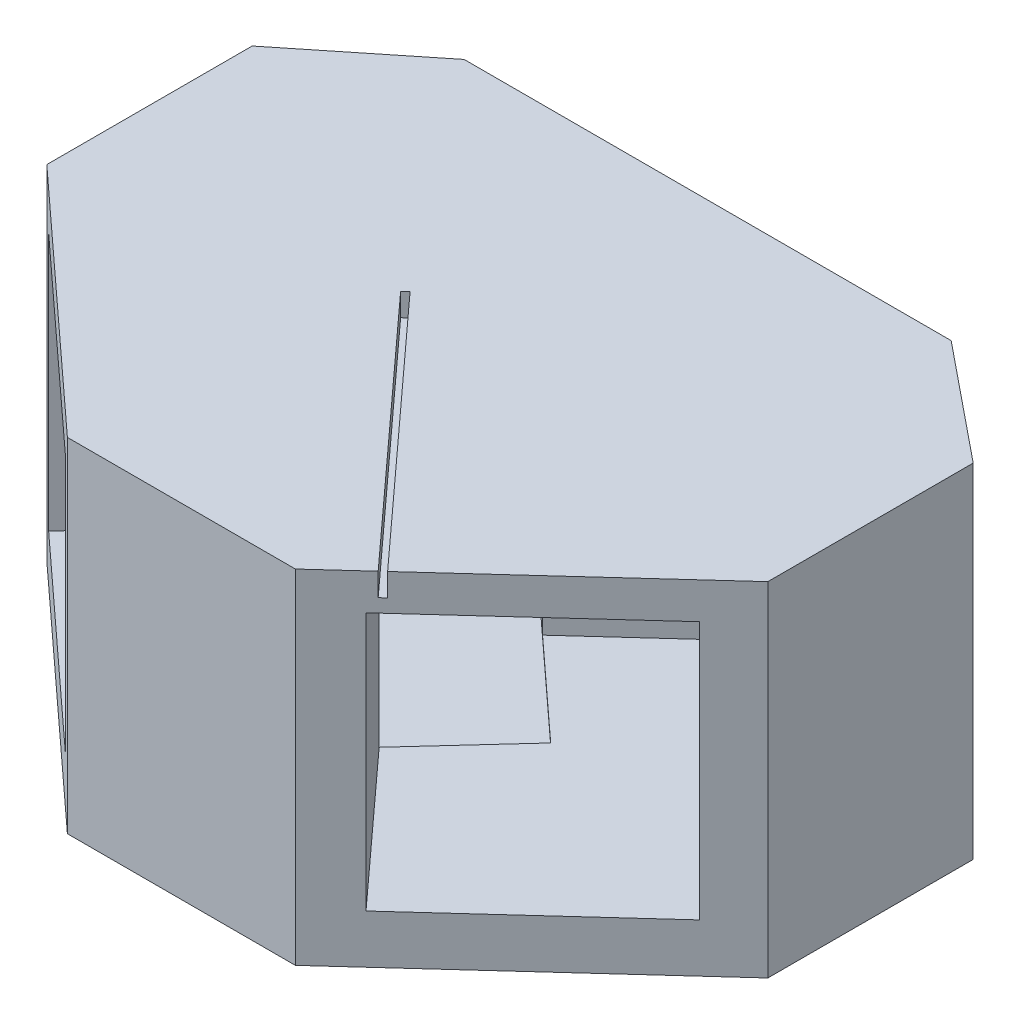
ISO-10303-21;
HEADER;
FILE_DESCRIPTION(('STEP AP214'),'2;1');
FILE_NAME('part.step','',(''),(''),'','','');
FILE_SCHEMA(('AUTOMOTIVE_DESIGN { 1 0 10303 214 1 1 1 1 }'));
ENDSEC;
DATA;
#1=APPLICATION_CONTEXT('core data for automotive mechanical design processes');
#2=APPLICATION_PROTOCOL_DEFINITION('international standard','automotive_design',2000,#1);
#3=PRODUCT_CONTEXT('',#1,'mechanical');
#4=PRODUCT('Part','Part','',(#3));
#5=PRODUCT_RELATED_PRODUCT_CATEGORY('part','',(#4));
#6=PRODUCT_DEFINITION_FORMATION('','',#4);
#7=PRODUCT_DEFINITION_CONTEXT('part definition',#1,'design');
#8=PRODUCT_DEFINITION('design','',#6,#7);
#9=PRODUCT_DEFINITION_SHAPE('','',#8);
#10=(LENGTH_UNIT() NAMED_UNIT(*) SI_UNIT(.MILLI.,.METRE.));
#11=(NAMED_UNIT(*) PLANE_ANGLE_UNIT() SI_UNIT($,.RADIAN.));
#12=(NAMED_UNIT(*) SI_UNIT($,.STERADIAN.) SOLID_ANGLE_UNIT());
#13=UNCERTAINTY_MEASURE_WITH_UNIT(LENGTH_MEASURE(1.E-05),#10,'distance_accuracy_value','');
#14=(GEOMETRIC_REPRESENTATION_CONTEXT(3) GLOBAL_UNCERTAINTY_ASSIGNED_CONTEXT((#13)) GLOBAL_UNIT_ASSIGNED_CONTEXT((#10,
#11,#12)) REPRESENTATION_CONTEXT('',''));
#15=CARTESIAN_POINT('',(0.,0.,0.));
#16=DIRECTION('',(0.,0.,1.));
#17=DIRECTION('',(1.,0.,0.));
#18=AXIS2_PLACEMENT_3D('',#15,#16,#17);
#19=CARTESIAN_POINT('',(-826.128986822205,117.,44.3964777462841));
#20=DIRECTION('',(1.,0.,0.));
#21=DIRECTION('',(0.,0.,-1.));
#22=AXIS2_PLACEMENT_3D('',#19,#20,#21);
#23=PLANE('',#22);
#24=DIRECTION('',(0.,0.,1.));
#25=VECTOR('',#24,1.);
#26=CARTESIAN_POINT('',(-826.128986822205,0.,44.3964777462841));
#27=LINE('',#26,#25);
#28=CARTESIAN_POINT('',(-826.128986822205,0.,44.3964777462841));
#29=VERTEX_POINT('',#28);
#30=CARTESIAN_POINT('',(-826.128986822205,0.,114.396477746284));
#31=VERTEX_POINT('',#30);
#32=EDGE_CURVE('E273',#29,#31,#27,.T.);
#33=ORIENTED_EDGE('',*,*,#32,.T.);
#34=DIRECTION('',(0.,-1.,0.));
#35=VECTOR('',#34,1.);
#36=CARTESIAN_POINT('',(-826.128986822205,117.,114.396477746284));
#37=LINE('',#36,#35);
#38=CARTESIAN_POINT('',(-826.128986822205,117.,114.396477746284));
#39=VERTEX_POINT('',#38);
#40=EDGE_CURVE('E397',#39,#31,#37,.T.);
#41=ORIENTED_EDGE('',*,*,#40,.F.);
#42=DIRECTION('',(0.,0.,1.));
#43=VECTOR('',#42,1.);
#44=CARTESIAN_POINT('',(-826.128986822205,117.,44.3964777462841));
#45=LINE('',#44,#43);
#46=CARTESIAN_POINT('',(-826.128986822205,117.,44.3964777462841));
#47=VERTEX_POINT('',#46);
#48=EDGE_CURVE('E318',#47,#39,#45,.T.);
#49=ORIENTED_EDGE('',*,*,#48,.F.);
#50=DIRECTION('',(0.,-1.,0.));
#51=VECTOR('',#50,1.);
#52=CARTESIAN_POINT('',(-826.128986822205,117.,44.3964777462841));
#53=LINE('',#52,#51);
#54=EDGE_CURVE('E346',#47,#29,#53,.T.);
#55=ORIENTED_EDGE('',*,*,#54,.T.);
#56=EDGE_LOOP('',(#33,#41,#49,#55));
#57=FACE_BOUND('',#56,.T.);
#58=ADVANCED_FACE('F39',(#57),#23,.F.);
#59=CARTESIAN_POINT('',(-742.08602868947,117.,191.421027003644));
#60=DIRECTION('',(0.675653940854031,0.,-0.7372189309889));
#61=DIRECTION('',(-0.7372189309889,0.,-0.675653940854031));
#62=AXIS2_PLACEMENT_3D('',#59,#60,#61);
#63=PLANE('',#62);
#64=DIRECTION('',(0.7372189309889,0.,0.675653940854031));
#65=VECTOR('',#64,1.);
#66=CARTESIAN_POINT('',(-818.637453873942,15.9702081014861,121.262394432311));
#67=LINE('',#66,#65);
#68=CARTESIAN_POINT('',(-818.637453873942,15.9702081014861,121.262394432311));
#69=VERTEX_POINT('',#68);
#70=CARTESIAN_POINT('',(-748.962414499242,15.9702081014861,185.11888665441));
#71=VERTEX_POINT('',#70);
#72=EDGE_CURVE('E223',#69,#71,#67,.T.);
#73=ORIENTED_EDGE('',*,*,#72,.F.);
#74=DIRECTION('',(0.,-1.,0.));
#75=VECTOR('',#74,1.);
#76=CARTESIAN_POINT('',(-818.637453873942,103.962880994965,121.262394432311));
#77=LINE('',#76,#75);
#78=CARTESIAN_POINT('',(-818.637453873942,103.962880994965,121.262394432311));
#79=VERTEX_POINT('',#78);
#80=EDGE_CURVE('E54',#79,#69,#77,.T.);
#81=ORIENTED_EDGE('',*,*,#80,.F.);
#82=DIRECTION('',(-0.7372189309889,0.,-0.675653940854031));
#83=VECTOR('',#82,1.);
#84=CARTESIAN_POINT('',(-818.637453873942,103.962880994965,121.262394432311));
#85=LINE('',#84,#83);
#86=CARTESIAN_POINT('',(-748.962414499242,103.962880994965,185.11888665441));
#87=VERTEX_POINT('',#86);
#88=EDGE_CURVE('E210',#87,#79,#85,.T.);
#89=ORIENTED_EDGE('',*,*,#88,.F.);
#90=DIRECTION('',(0.,1.,0.));
#91=VECTOR('',#90,1.);
#92=CARTESIAN_POINT('',(-748.962414499242,103.962880994965,185.11888665441));
#93=LINE('',#92,#91);
#94=EDGE_CURVE('E214',#71,#87,#93,.T.);
#95=ORIENTED_EDGE('',*,*,#94,.F.);
#96=EDGE_LOOP('',(#73,#81,#89,#95));
#97=FACE_BOUND('',#96,.T.);
#98=DIRECTION('',(0.7372189309889,0.,0.675653940854031));
#99=VECTOR('',#98,1.);
#100=CARTESIAN_POINT('',(-742.08602868947,0.,191.421027003644));
#101=LINE('',#100,#99);
#102=CARTESIAN_POINT('',(-742.08602868947,0.,191.421027003644));
#103=VERTEX_POINT('',#102);
#104=EDGE_CURVE('E350',#31,#103,#101,.T.);
#105=ORIENTED_EDGE('',*,*,#104,.T.);
#106=DIRECTION('',(0.,-1.,0.));
#107=VECTOR('',#106,1.);
#108=CARTESIAN_POINT('',(-742.08602868947,117.,191.421027003644));
#109=LINE('',#108,#107);
#110=CARTESIAN_POINT('',(-742.08602868947,117.,191.421027003644));
#111=VERTEX_POINT('',#110);
#112=EDGE_CURVE('E393',#111,#103,#109,.T.);
#113=ORIENTED_EDGE('',*,*,#112,.F.);
#114=DIRECTION('',(0.7372189309889,0.,0.675653940854031));
#115=VECTOR('',#114,1.);
#116=CARTESIAN_POINT('',(-742.08602868947,117.,191.421027003644));
#117=LINE('',#116,#115);
#118=EDGE_CURVE('E322',#39,#111,#117,.T.);
#119=ORIENTED_EDGE('',*,*,#118,.F.);
#120=ORIENTED_EDGE('',*,*,#40,.T.);
#121=EDGE_LOOP('',(#105,#113,#119,#120));
#122=FACE_BOUND('',#121,.T.);
#123=ADVANCED_FACE('F446',(#97,#122),#63,.F.);
#124=CARTESIAN_POINT('',(-664.384727067971,117.,191.421027003644));
#125=DIRECTION('',(0.,0.,-1.));
#126=DIRECTION('',(-1.,0.,0.));
#127=AXIS2_PLACEMENT_3D('',#124,#125,#126);
#128=PLANE('',#127);
#129=DIRECTION('',(1.,0.,0.));
#130=VECTOR('',#129,1.);
#131=CARTESIAN_POINT('',(-664.384727067971,0.,191.421027003644));
#132=LINE('',#131,#130);
#133=CARTESIAN_POINT('',(-664.384727067971,0.,191.421027003644));
#134=VERTEX_POINT('',#133);
#135=EDGE_CURVE('E353',#103,#134,#132,.T.);
#136=ORIENTED_EDGE('',*,*,#135,.T.);
#137=DIRECTION('',(0.,-1.,0.));
#138=VECTOR('',#137,1.);
#139=CARTESIAN_POINT('',(-664.384727067971,117.,191.421027003644));
#140=LINE('',#139,#138);
#141=CARTESIAN_POINT('',(-664.384727067971,117.,191.421027003644));
#142=VERTEX_POINT('',#141);
#143=EDGE_CURVE('E389',#142,#134,#140,.T.);
#144=ORIENTED_EDGE('',*,*,#143,.F.);
#145=DIRECTION('',(1.,0.,0.));
#146=VECTOR('',#145,1.);
#147=CARTESIAN_POINT('',(-664.384727067971,117.,191.421027003644));
#148=LINE('',#147,#146);
#149=EDGE_CURVE('E326',#111,#142,#148,.T.);
#150=ORIENTED_EDGE('',*,*,#149,.F.);
#151=ORIENTED_EDGE('',*,*,#112,.T.);
#152=EDGE_LOOP('',(#136,#144,#150,#151));
#153=FACE_BOUND('',#152,.T.);
#154=ADVANCED_FACE('F449',(#153),#128,.F.);
#155=CARTESIAN_POINT('',(-580.129096877642,117.,114.629173391229));
#156=DIRECTION('',(-0.673612750986098,0.,-0.739084475353759));
#157=DIRECTION('',(-0.739084475353759,0.,0.673612750986098));
#158=AXIS2_PLACEMENT_3D('',#155,#156,#157);
#159=PLANE('',#158);
#160=DIRECTION('',(0.73908447535376,0.,-0.673612750986097));
#161=VECTOR('',#160,1.);
#162=CARTESIAN_POINT('',(-651.786182515414,16.6091042605447,179.938523260879));
#163=LINE('',#162,#161);
#164=CARTESIAN_POINT('',(-651.786182515414,16.6091042605447,179.938523260879));
#165=VERTEX_POINT('',#164);
#166=CARTESIAN_POINT('',(-592.273770508985,16.6091042605447,125.698012322964));
#167=VERTEX_POINT('',#166);
#168=EDGE_CURVE('E297',#165,#167,#163,.T.);
#169=ORIENTED_EDGE('',*,*,#168,.F.);
#170=DIRECTION('',(0.,-1.,0.));
#171=VECTOR('',#170,1.);
#172=CARTESIAN_POINT('',(-651.786182515414,104.628885191697,179.938523260879));
#173=LINE('',#172,#171);
#174=CARTESIAN_POINT('',(-651.786182515414,104.628885191697,179.938523260879));
#175=VERTEX_POINT('',#174);
#176=EDGE_CURVE('E247',#175,#165,#173,.T.);
#177=ORIENTED_EDGE('',*,*,#176,.F.);
#178=DIRECTION('',(-0.73908447535376,0.,0.673612750986097));
#179=VECTOR('',#178,1.);
#180=CARTESIAN_POINT('',(-651.786182515414,104.628885191697,179.938523260879));
#181=LINE('',#180,#179);
#182=CARTESIAN_POINT('',(-592.273770508985,104.628885191697,125.698012322964));
#183=VERTEX_POINT('',#182);
#184=EDGE_CURVE('E282',#183,#175,#181,.T.);
#185=ORIENTED_EDGE('',*,*,#184,.F.);
#186=DIRECTION('',(0.,1.,0.));
#187=VECTOR('',#186,1.);
#188=CARTESIAN_POINT('',(-592.273770508985,104.628885191697,125.698012322964));
#189=LINE('',#188,#187);
#190=EDGE_CURVE('E301',#167,#183,#189,.T.);
#191=ORIENTED_EDGE('',*,*,#190,.F.);
#192=EDGE_LOOP('',(#169,#177,#185,#191));
#193=FACE_BOUND('',#192,.T.);
#194=DIRECTION('',(0.739084475353759,0.,-0.673612750986098));
#195=VECTOR('',#194,1.);
#196=CARTESIAN_POINT('',(-580.129096877642,117.,114.629173391229));
#197=LINE('',#196,#195);
#198=CARTESIAN_POINT('',(-647.931127486634,117.,176.424967896458));
#199=VERTEX_POINT('',#198);
#200=CARTESIAN_POINT('',(-580.129096877642,117.,114.629173391229));
#201=VERTEX_POINT('',#200);
#202=EDGE_CURVE('E329',#199,#201,#197,.T.);
#203=ORIENTED_EDGE('',*,*,#202,.F.);
#204=DIRECTION('',(0.,1.,0.));
#205=VECTOR('',#204,1.);
#206=CARTESIAN_POINT('',(-647.931127486634,132.990814602846,176.424967896458));
#207=LINE('',#206,#205);
#208=CARTESIAN_POINT('',(-647.931127486634,109.192873832572,176.424967896458));
#209=VERTEX_POINT('',#208);
#210=EDGE_CURVE('E260',#209,#199,#207,.T.);
#211=ORIENTED_EDGE('',*,*,#210,.F.);
#212=DIRECTION('',(0.739084475353746,0.,-0.673612750986112));
#213=VECTOR('',#212,1.);
#214=CARTESIAN_POINT('',(-647.931127486634,109.192873832572,176.424967896458));
#215=LINE('',#214,#213);
#216=CARTESIAN_POINT('',(-649.617714061739,109.192873832572,177.962148368404));
#217=VERTEX_POINT('',#216);
#218=EDGE_CURVE('E252',#217,#209,#215,.T.);
#219=ORIENTED_EDGE('',*,*,#218,.F.);
#220=DIRECTION('',(0.,-1.,0.));
#221=VECTOR('',#220,1.);
#222=CARTESIAN_POINT('',(-649.617714061739,132.990814602846,177.962148368404));
#223=LINE('',#222,#221);
#224=CARTESIAN_POINT('',(-649.617714061739,117.,177.962148368404));
#225=VERTEX_POINT('',#224);
#226=EDGE_CURVE('E263',#225,#217,#223,.T.);
#227=ORIENTED_EDGE('',*,*,#226,.F.);
#228=EDGE_CURVE('E330',#142,#225,#197,.T.);
#229=ORIENTED_EDGE('',*,*,#228,.F.);
#230=ORIENTED_EDGE('',*,*,#143,.T.);
#231=DIRECTION('',(0.739084475353759,0.,-0.673612750986098));
#232=VECTOR('',#231,1.);
#233=CARTESIAN_POINT('',(-580.129096877642,0.,114.629173391229));
#234=LINE('',#233,#232);
#235=CARTESIAN_POINT('',(-580.129096877642,0.,114.629173391229));
#236=VERTEX_POINT('',#235);
#237=EDGE_CURVE('E356',#134,#236,#234,.T.);
#238=ORIENTED_EDGE('',*,*,#237,.T.);
#239=DIRECTION('',(0.,-1.,0.));
#240=VECTOR('',#239,1.);
#241=CARTESIAN_POINT('',(-580.129096877642,117.,114.629173391229));
#242=LINE('',#241,#240);
#243=EDGE_CURVE('E385',#201,#236,#242,.T.);
#244=ORIENTED_EDGE('',*,*,#243,.F.);
#245=EDGE_LOOP('',(#203,#211,#219,#227,#229,#230,#238,#244));
#246=FACE_BOUND('',#245,.T.);
#247=ADVANCED_FACE('F435',(#193,#246),#159,.F.);
#248=CARTESIAN_POINT('',(-580.129096877642,117.,44.6291733912285));
#249=DIRECTION('',(-1.,0.,0.));
#250=DIRECTION('',(0.,0.,1.));
#251=AXIS2_PLACEMENT_3D('',#248,#249,#250);
#252=PLANE('',#251);
#253=DIRECTION('',(0.,0.,-1.));
#254=VECTOR('',#253,1.);
#255=CARTESIAN_POINT('',(-580.129096877642,0.,44.6291733912285));
#256=LINE('',#255,#254);
#257=CARTESIAN_POINT('',(-580.129096877642,0.,44.6291733912285));
#258=VERTEX_POINT('',#257);
#259=EDGE_CURVE('E359',#236,#258,#256,.T.);
#260=ORIENTED_EDGE('',*,*,#259,.T.);
#261=DIRECTION('',(0.,-1.,0.));
#262=VECTOR('',#261,1.);
#263=CARTESIAN_POINT('',(-580.129096877642,117.,44.6291733912285));
#264=LINE('',#263,#262);
#265=CARTESIAN_POINT('',(-580.129096877642,117.,44.6291733912285));
#266=VERTEX_POINT('',#265);
#267=EDGE_CURVE('E381',#266,#258,#264,.T.);
#268=ORIENTED_EDGE('',*,*,#267,.F.);
#269=DIRECTION('',(0.,0.,-1.));
#270=VECTOR('',#269,1.);
#271=CARTESIAN_POINT('',(-580.129096877642,117.,44.6291733912285));
#272=LINE('',#271,#270);
#273=EDGE_CURVE('E334',#201,#266,#272,.T.);
#274=ORIENTED_EDGE('',*,*,#273,.F.);
#275=ORIENTED_EDGE('',*,*,#243,.T.);
#276=EDGE_LOOP('',(#260,#268,#274,#275));
#277=FACE_BOUND('',#276,.T.);
#278=ADVANCED_FACE('F467',(#277),#252,.F.);
#279=CARTESIAN_POINT('',(-620.035151566859,117.,12.2336984118236));
#280=DIRECTION('',(-0.630262159132391,0.,0.776382386949741));
#281=DIRECTION('',(0.776382386949741,0.,0.630262159132391));
#282=AXIS2_PLACEMENT_3D('',#279,#280,#281);
#283=PLANE('',#282);
#284=DIRECTION('',(-0.776382386949741,0.,-0.630262159132391));
#285=VECTOR('',#284,1.);
#286=CARTESIAN_POINT('',(-620.035151566859,0.,12.2336984118236));
#287=LINE('',#286,#285);
#288=CARTESIAN_POINT('',(-620.035151566859,0.,12.2336984118236));
#289=VERTEX_POINT('',#288);
#290=EDGE_CURVE('E362',#258,#289,#287,.T.);
#291=ORIENTED_EDGE('',*,*,#290,.T.);
#292=DIRECTION('',(0.,-1.,0.));
#293=VECTOR('',#292,1.);
#294=CARTESIAN_POINT('',(-620.035151566859,117.,12.2336984118236));
#295=LINE('',#294,#293);
#296=CARTESIAN_POINT('',(-620.035151566859,117.,12.2336984118236));
#297=VERTEX_POINT('',#296);
#298=EDGE_CURVE('E377',#297,#289,#295,.T.);
#299=ORIENTED_EDGE('',*,*,#298,.F.);
#300=DIRECTION('',(-0.776382386949741,0.,-0.630262159132391));
#301=VECTOR('',#300,1.);
#302=CARTESIAN_POINT('',(-620.035151566859,117.,12.2336984118236));
#303=LINE('',#302,#301);
#304=EDGE_CURVE('E337',#266,#297,#303,.T.);
#305=ORIENTED_EDGE('',*,*,#304,.F.);
#306=ORIENTED_EDGE('',*,*,#267,.T.);
#307=EDGE_LOOP('',(#291,#299,#305,#306));
#308=FACE_BOUND('',#307,.T.);
#309=ADVANCED_FACE('F501',(#308),#283,.F.);
#310=CARTESIAN_POINT('',(-786.035151566859,117.,12.2336984118236));
#311=DIRECTION('',(0.,0.,1.));
#312=DIRECTION('',(1.,0.,0.));
#313=AXIS2_PLACEMENT_3D('',#310,#311,#312);
#314=PLANE('',#313);
#315=DIRECTION('',(-1.,0.,0.));
#316=VECTOR('',#315,1.);
#317=CARTESIAN_POINT('',(-786.035151566859,0.,12.2336984118236));
#318=LINE('',#317,#316);
#319=CARTESIAN_POINT('',(-786.035151566859,0.,12.2336984118236));
#320=VERTEX_POINT('',#319);
#321=EDGE_CURVE('E365',#289,#320,#318,.T.);
#322=ORIENTED_EDGE('',*,*,#321,.T.);
#323=DIRECTION('',(0.,-1.,0.));
#324=VECTOR('',#323,1.);
#325=CARTESIAN_POINT('',(-786.035151566859,117.,12.2336984118236));
#326=LINE('',#325,#324);
#327=CARTESIAN_POINT('',(-786.035151566859,117.,12.2336984118236));
#328=VERTEX_POINT('',#327);
#329=EDGE_CURVE('E373',#328,#320,#326,.T.);
#330=ORIENTED_EDGE('',*,*,#329,.F.);
#331=DIRECTION('',(-1.,0.,0.));
#332=VECTOR('',#331,1.);
#333=CARTESIAN_POINT('',(-786.035151566859,117.,12.2336984118236));
#334=LINE('',#333,#332);
#335=EDGE_CURVE('E340',#297,#328,#334,.T.);
#336=ORIENTED_EDGE('',*,*,#335,.F.);
#337=ORIENTED_EDGE('',*,*,#298,.T.);
#338=EDGE_LOOP('',(#322,#330,#336,#337));
#339=FACE_BOUND('',#338,.T.);
#340=ADVANCED_FACE('F499',(#339),#314,.F.);
#341=CARTESIAN_POINT('',(-826.128986822205,117.,44.3964777462841));
#342=DIRECTION('',(0.625735006507013,0.,0.78003570535692));
#343=DIRECTION('',(0.780035705356921,0.,-0.625735006507013));
#344=AXIS2_PLACEMENT_3D('',#341,#342,#343);
#345=PLANE('',#344);
#346=DIRECTION('',(-0.780035705356921,0.,0.625735006507013));
#347=VECTOR('',#346,1.);
#348=CARTESIAN_POINT('',(-826.128986822205,0.,44.3964777462841));
#349=LINE('',#348,#347);
#350=EDGE_CURVE('E323',#320,#29,#349,.T.);
#351=ORIENTED_EDGE('',*,*,#350,.T.);
#352=ORIENTED_EDGE('',*,*,#54,.F.);
#353=DIRECTION('',(-0.780035705356921,0.,0.625735006507013));
#354=VECTOR('',#353,1.);
#355=CARTESIAN_POINT('',(-826.128986822205,117.,44.3964777462841));
#356=LINE('',#355,#354);
#357=EDGE_CURVE('E343',#328,#47,#356,.T.);
#358=ORIENTED_EDGE('',*,*,#357,.F.);
#359=ORIENTED_EDGE('',*,*,#329,.T.);
#360=EDGE_LOOP('',(#351,#352,#358,#359));
#361=FACE_BOUND('',#360,.T.);
#362=ADVANCED_FACE('F495',(#361),#345,.F.);
#363=CARTESIAN_POINT('',(0.,117.,0.));
#364=DIRECTION('',(0.,-1.,0.));
#365=DIRECTION('',(0.,0.,-1.));
#366=AXIS2_PLACEMENT_3D('',#363,#364,#365);
#367=PLANE('',#366);
#368=DIRECTION('',(0.739084475353746,0.,-0.673612750986112));
#369=VECTOR('',#368,1.);
#370=CARTESIAN_POINT('',(-284.979765273042,117.,-312.678345228656));
#371=LINE('',#370,#369);
#372=CARTESIAN_POINT('',(-728.430405927112,117.,91.4892647520145));
#373=VERTEX_POINT('',#372);
#374=CARTESIAN_POINT('',(-726.743819352008,117.,89.9520842800683));
#375=VERTEX_POINT('',#374);
#376=EDGE_CURVE('E401',#373,#375,#371,.T.);
#377=ORIENTED_EDGE('',*,*,#376,.T.);
#378=DIRECTION('',(0.673612750986098,0.,0.739084475353759));
#379=VECTOR('',#378,1.);
#380=CARTESIAN_POINT('',(-441.764054078979,117.,402.630429508722));
#381=LINE('',#380,#379);
#382=EDGE_CURVE('E409',#375,#199,#381,.T.);
#383=ORIENTED_EDGE('',*,*,#382,.T.);
#384=ORIENTED_EDGE('',*,*,#202,.T.);
#385=ORIENTED_EDGE('',*,*,#273,.T.);
#386=ORIENTED_EDGE('',*,*,#304,.T.);
#387=ORIENTED_EDGE('',*,*,#335,.T.);
#388=ORIENTED_EDGE('',*,*,#357,.T.);
#389=ORIENTED_EDGE('',*,*,#48,.T.);
#390=ORIENTED_EDGE('',*,*,#118,.T.);
#391=ORIENTED_EDGE('',*,*,#149,.T.);
#392=ORIENTED_EDGE('',*,*,#228,.T.);
#393=DIRECTION('',(-0.673612750986098,0.,-0.739084475353759));
#394=VECTOR('',#393,1.);
#395=CARTESIAN_POINT('',(-443.450640654083,117.,404.167609980668));
#396=LINE('',#395,#394);
#397=EDGE_CURVE('E405',#225,#373,#396,.T.);
#398=ORIENTED_EDGE('',*,*,#397,.T.);
#399=EDGE_LOOP('',(#377,#383,#384,#385,#386,#387,#388,#389,#390,#391,#392,#398));
#400=FACE_BOUND('',#399,.T.);
#401=ADVANCED_FACE('F471',(#400),#367,.F.);
#402=CARTESIAN_POINT('',(0.,0.,0.));
#403=DIRECTION('',(0.,-1.,0.));
#404=DIRECTION('',(0.,0.,-1.));
#405=AXIS2_PLACEMENT_3D('',#402,#403,#404);
#406=PLANE('',#405);
#407=ORIENTED_EDGE('',*,*,#32,.F.);
#408=ORIENTED_EDGE('',*,*,#350,.F.);
#409=ORIENTED_EDGE('',*,*,#321,.F.);
#410=ORIENTED_EDGE('',*,*,#290,.F.);
#411=ORIENTED_EDGE('',*,*,#259,.F.);
#412=ORIENTED_EDGE('',*,*,#237,.F.);
#413=ORIENTED_EDGE('',*,*,#135,.F.);
#414=ORIENTED_EDGE('',*,*,#104,.F.);
#415=EDGE_LOOP('',(#407,#408,#409,#410,#411,#412,#413,#414));
#416=FACE_BOUND('',#415,.T.);
#417=ADVANCED_FACE('F459',(#416),#406,.T.);
#418=CARTESIAN_POINT('',(-726.743819352008,132.990814602846,89.9520842800684));
#419=DIRECTION('',(0.739084475353759,0.,-0.673612750986098));
#420=DIRECTION('',(-0.673612750986098,0.,-0.739084475353759));
#421=AXIS2_PLACEMENT_3D('',#418,#419,#420);
#422=PLANE('',#421);
#423=DIRECTION('',(0.,1.,0.));
#424=VECTOR('',#423,1.);
#425=CARTESIAN_POINT('',(-726.743819352008,132.990814602846,89.9520842800684));
#426=LINE('',#425,#424);
#427=CARTESIAN_POINT('',(-726.743819352008,109.192873832572,89.9520842800684));
#428=VERTEX_POINT('',#427);
#429=EDGE_CURVE('E248',#428,#375,#426,.T.);
#430=ORIENTED_EDGE('',*,*,#429,.F.);
#431=DIRECTION('',(0.673612750986098,0.,0.739084475353759));
#432=VECTOR('',#431,1.);
#433=CARTESIAN_POINT('',(-726.743819352008,109.192873832572,89.9520842800684));
#434=LINE('',#433,#432);
#435=EDGE_CURVE('E270',#428,#209,#434,.T.);
#436=ORIENTED_EDGE('',*,*,#435,.T.);
#437=ORIENTED_EDGE('',*,*,#210,.T.);
#438=ORIENTED_EDGE('',*,*,#382,.F.);
#439=EDGE_LOOP('',(#430,#436,#437,#438));
#440=FACE_BOUND('',#439,.T.);
#441=ADVANCED_FACE('F480',(#440),#422,.F.);
#442=CARTESIAN_POINT('',(-728.430405927112,132.990814602846,91.4892647520145));
#443=DIRECTION('',(-0.739084475353759,0.,0.673612750986098));
#444=DIRECTION('',(0.673612750986098,0.,0.739084475353759));
#445=AXIS2_PLACEMENT_3D('',#442,#443,#444);
#446=PLANE('',#445);
#447=ORIENTED_EDGE('',*,*,#226,.T.);
#448=DIRECTION('',(0.673612750986098,0.,0.739084475353759));
#449=VECTOR('',#448,1.);
#450=CARTESIAN_POINT('',(-728.430405927112,109.192873832572,91.4892647520145));
#451=LINE('',#450,#449);
#452=CARTESIAN_POINT('',(-728.430405927112,109.192873832572,91.4892647520145));
#453=VERTEX_POINT('',#452);
#454=EDGE_CURVE('E259',#453,#217,#451,.T.);
#455=ORIENTED_EDGE('',*,*,#454,.F.);
#456=DIRECTION('',(0.,-1.,0.));
#457=VECTOR('',#456,1.);
#458=CARTESIAN_POINT('',(-728.430405927112,132.990814602846,91.4892647520145));
#459=LINE('',#458,#457);
#460=EDGE_CURVE('E251',#373,#453,#459,.T.);
#461=ORIENTED_EDGE('',*,*,#460,.F.);
#462=ORIENTED_EDGE('',*,*,#397,.F.);
#463=EDGE_LOOP('',(#447,#455,#461,#462));
#464=FACE_BOUND('',#463,.T.);
#465=ADVANCED_FACE('F487',(#464),#446,.F.);
#466=CARTESIAN_POINT('',(-284.979765273041,0.,-312.678345228658));
#467=DIRECTION('',(-0.673612750986112,0.,-0.739084475353746));
#468=DIRECTION('',(-0.739084475353746,0.,0.673612750986112));
#469=AXIS2_PLACEMENT_3D('',#466,#467,#468);
#470=PLANE('',#469);
#471=ORIENTED_EDGE('',*,*,#460,.T.);
#472=DIRECTION('',(0.739084475353746,0.,-0.673612750986112));
#473=VECTOR('',#472,1.);
#474=CARTESIAN_POINT('',(-726.743819352008,109.192873832572,89.9520842800684));
#475=LINE('',#474,#473);
#476=EDGE_CURVE('E255',#453,#428,#475,.T.);
#477=ORIENTED_EDGE('',*,*,#476,.T.);
#478=ORIENTED_EDGE('',*,*,#429,.T.);
#479=ORIENTED_EDGE('',*,*,#376,.F.);
#480=EDGE_LOOP('',(#471,#477,#478,#479));
#481=FACE_BOUND('',#480,.T.);
#482=ADVANCED_FACE('F579',(#481),#470,.F.);
#483=CARTESIAN_POINT('',(-726.743819352008,109.192873832572,89.9520842800684));
#484=DIRECTION('',(0.,-1.,0.));
#485=DIRECTION('',(0.,0.,-1.));
#486=AXIS2_PLACEMENT_3D('',#483,#484,#485);
#487=PLANE('',#486);
#488=ORIENTED_EDGE('',*,*,#218,.T.);
#489=ORIENTED_EDGE('',*,*,#435,.F.);
#490=ORIENTED_EDGE('',*,*,#476,.F.);
#491=ORIENTED_EDGE('',*,*,#454,.T.);
#492=EDGE_LOOP('',(#488,#489,#490,#491));
#493=FACE_BOUND('',#492,.T.);
#494=ADVANCED_FACE('F483',(#493),#487,.F.);
#495=CARTESIAN_POINT('',(-730.598874380788,104.628885191697,93.4656396444893));
#496=DIRECTION('',(-0.739084475353759,0.,0.673612750986098));
#497=DIRECTION('',(0.673612750986098,0.,0.739084475353759));
#498=AXIS2_PLACEMENT_3D('',#495,#496,#497);
#499=PLANE('',#498);
#500=DIRECTION('',(0.,1.,0.));
#501=VECTOR('',#500,1.);
#502=CARTESIAN_POINT('',(-697.872109948462,104.628885191697,129.373278692419));
#503=LINE('',#502,#501);
#504=CARTESIAN_POINT('',(-697.872109948462,16.6091042605447,129.373278692419));
#505=VERTEX_POINT('',#504);
#506=CARTESIAN_POINT('',(-697.872109948462,103.962880994965,129.373278692419));
#507=VERTEX_POINT('',#506);
#508=EDGE_CURVE('E243',#505,#507,#503,.T.);
#509=ORIENTED_EDGE('',*,*,#508,.T.);
#510=DIRECTION('',(-0.673612750986098,0.,-0.739084475353759));
#511=VECTOR('',#510,1.);
#512=CARTESIAN_POINT('',(-730.598874380788,103.962880994965,93.4656396444893));
#513=LINE('',#512,#511);
#514=CARTESIAN_POINT('',(-730.598874380788,103.962880994965,93.4656396444893));
#515=VERTEX_POINT('',#514);
#516=EDGE_CURVE('E239',#507,#515,#513,.T.);
#517=ORIENTED_EDGE('',*,*,#516,.T.);
#518=DIRECTION('',(0.,-1.,0.));
#519=VECTOR('',#518,1.);
#520=CARTESIAN_POINT('',(-730.598874380788,104.628885191697,93.4656396444893));
#521=LINE('',#520,#519);
#522=CARTESIAN_POINT('',(-730.598874380788,104.628885191697,93.4656396444893));
#523=VERTEX_POINT('',#522);
#524=EDGE_CURVE('E277',#523,#515,#521,.T.);
#525=ORIENTED_EDGE('',*,*,#524,.F.);
#526=DIRECTION('',(0.673612750986098,0.,0.739084475353759));
#527=VECTOR('',#526,1.);
#528=CARTESIAN_POINT('',(-730.598874380788,104.628885191697,93.4656396444893));
#529=LINE('',#528,#527);
#530=EDGE_CURVE('E264',#523,#175,#529,.T.);
#531=ORIENTED_EDGE('',*,*,#530,.T.);
#532=ORIENTED_EDGE('',*,*,#176,.T.);
#533=DIRECTION('',(0.673612750986098,0.,0.739084475353759));
#534=VECTOR('',#533,1.);
#535=CARTESIAN_POINT('',(-730.598874380788,16.6091042605447,93.4656396444893));
#536=LINE('',#535,#534);
#537=EDGE_CURVE('E293',#505,#165,#536,.T.);
#538=ORIENTED_EDGE('',*,*,#537,.F.);
#539=EDGE_LOOP('',(#509,#517,#525,#531,#532,#538));
#540=FACE_BOUND('',#539,.T.);
#541=ADVANCED_FACE('F423',(#540),#499,.F.);
#542=CARTESIAN_POINT('',(-730.598874380788,104.628885191697,93.4656396444893));
#543=DIRECTION('',(0.,1.,0.));
#544=DIRECTION('',(0.,0.,1.));
#545=AXIS2_PLACEMENT_3D('',#542,#543,#544);
#546=PLANE('',#545);
#547=ORIENTED_EDGE('',*,*,#184,.T.);
#548=ORIENTED_EDGE('',*,*,#530,.F.);
#549=DIRECTION('',(-0.73908447535376,0.,0.673612750986097));
#550=VECTOR('',#549,1.);
#551=CARTESIAN_POINT('',(-730.598874380788,104.628885191697,93.4656396444893));
#552=LINE('',#551,#550);
#553=CARTESIAN_POINT('',(-671.086462374359,104.628885191697,39.2251287065744));
#554=VERTEX_POINT('',#553);
#555=EDGE_CURVE('E289',#554,#523,#552,.T.);
#556=ORIENTED_EDGE('',*,*,#555,.F.);
#557=DIRECTION('',(0.673612750986098,0.,0.739084475353759));
#558=VECTOR('',#557,1.);
#559=CARTESIAN_POINT('',(-671.086462374359,104.628885191697,39.2251287065744));
#560=LINE('',#559,#558);
#561=EDGE_CURVE('E310',#554,#183,#560,.T.);
#562=ORIENTED_EDGE('',*,*,#561,.T.);
#563=EDGE_LOOP('',(#547,#548,#556,#562));
#564=FACE_BOUND('',#563,.T.);
#565=ADVANCED_FACE('F429',(#564),#546,.F.);
#566=CARTESIAN_POINT('',(-671.086462374359,104.628885191697,39.2251287065744));
#567=DIRECTION('',(0.739084475353759,0.,-0.673612750986098));
#568=DIRECTION('',(-0.673612750986098,0.,-0.739084475353759));
#569=AXIS2_PLACEMENT_3D('',#566,#567,#568);
#570=PLANE('',#569);
#571=ORIENTED_EDGE('',*,*,#190,.T.);
#572=ORIENTED_EDGE('',*,*,#561,.F.);
#573=DIRECTION('',(0.,1.,0.));
#574=VECTOR('',#573,1.);
#575=CARTESIAN_POINT('',(-671.086462374359,104.628885191697,39.2251287065744));
#576=LINE('',#575,#574);
#577=CARTESIAN_POINT('',(-671.086462374359,16.6091042605447,39.2251287065744));
#578=VERTEX_POINT('',#577);
#579=EDGE_CURVE('E285',#578,#554,#576,.T.);
#580=ORIENTED_EDGE('',*,*,#579,.F.);
#581=DIRECTION('',(0.673612750986098,0.,0.739084475353759));
#582=VECTOR('',#581,1.);
#583=CARTESIAN_POINT('',(-671.086462374359,16.6091042605447,39.2251287065744));
#584=LINE('',#583,#582);
#585=EDGE_CURVE('E313',#578,#167,#584,.T.);
#586=ORIENTED_EDGE('',*,*,#585,.T.);
#587=EDGE_LOOP('',(#571,#572,#580,#586));
#588=FACE_BOUND('',#587,.T.);
#589=ADVANCED_FACE('F605',(#588),#570,.F.);
#590=CARTESIAN_POINT('',(-730.598874380788,16.6091042605447,93.4656396444893));
#591=DIRECTION('',(0.,-1.,0.));
#592=DIRECTION('',(0.,0.,-1.));
#593=AXIS2_PLACEMENT_3D('',#590,#591,#592);
#594=PLANE('',#593);
#595=DIRECTION('',(-0.7372189309889,0.,-0.675653940854032));
#596=VECTOR('',#595,1.);
#597=CARTESIAN_POINT('',(-705.583400059993,16.6091042605447,66.1707774053293));
#598=LINE('',#597,#596);
#599=CARTESIAN_POINT('',(-669.91090341932,16.6091042605447,98.8642717287081));
#600=VERTEX_POINT('',#599);
#601=CARTESIAN_POINT('',(-703.124092589675,16.6091042605447,68.4247086518637));
#602=VERTEX_POINT('',#601);
#603=EDGE_CURVE('E62',#600,#602,#598,.T.);
#604=ORIENTED_EDGE('',*,*,#603,.F.);
#605=DIRECTION('',(-0.675653940854031,0.,0.7372189309889));
#606=VECTOR('',#605,1.);
#607=CARTESIAN_POINT('',(-694.926377740114,16.6091042605447,126.159133967868));
#608=LINE('',#607,#606);
#609=EDGE_CURVE('E11',#600,#505,#608,.T.);
#610=ORIENTED_EDGE('',*,*,#609,.T.);
#611=ORIENTED_EDGE('',*,*,#537,.T.);
#612=ORIENTED_EDGE('',*,*,#168,.T.);
#613=ORIENTED_EDGE('',*,*,#585,.F.);
#614=DIRECTION('',(0.73908447535376,0.,-0.673612750986097));
#615=VECTOR('',#614,1.);
#616=CARTESIAN_POINT('',(-730.598874380788,16.6091042605447,93.4656396444893));
#617=LINE('',#616,#615);
#618=EDGE_CURVE('E281',#602,#578,#617,.T.);
#619=ORIENTED_EDGE('',*,*,#618,.F.);
#620=EDGE_LOOP('',(#604,#610,#611,#612,#613,#619));
#621=FACE_BOUND('',#620,.T.);
#622=ADVANCED_FACE('F439',(#621),#594,.F.);
#623=CARTESIAN_POINT('',(-284.979765273028,0.,-312.678345228653));
#624=DIRECTION('',(0.673612750986097,0.,0.73908447535376));
#625=DIRECTION('',(0.73908447535376,0.,-0.673612750986097));
#626=AXIS2_PLACEMENT_3D('',#623,#624,#625);
#627=PLANE('',#626);
#628=DIRECTION('',(-0.73908447535376,0.,0.673612750986097));
#629=VECTOR('',#628,1.);
#630=CARTESIAN_POINT('',(-284.979765273028,103.962880994965,-312.678345228653));
#631=LINE('',#630,#629);
#632=CARTESIAN_POINT('',(-703.124092589675,103.962880994965,68.4247086518635));
#633=VERTEX_POINT('',#632);
#634=EDGE_CURVE('E47',#633,#515,#631,.T.);
#635=ORIENTED_EDGE('',*,*,#634,.F.);
#636=DIRECTION('',(0.,-1.,0.));
#637=VECTOR('',#636,1.);
#638=CARTESIAN_POINT('',(-703.124092589675,0.,68.4247086518637));
#639=LINE('',#638,#637);
#640=EDGE_CURVE('E413',#633,#602,#639,.T.);
#641=ORIENTED_EDGE('',*,*,#640,.T.);
#642=ORIENTED_EDGE('',*,*,#618,.T.);
#643=ORIENTED_EDGE('',*,*,#579,.T.);
#644=ORIENTED_EDGE('',*,*,#555,.T.);
#645=ORIENTED_EDGE('',*,*,#524,.T.);
#646=EDGE_LOOP('',(#635,#641,#642,#643,#644,#645));
#647=FACE_BOUND('',#646,.T.);
#648=ADVANCED_FACE('F425',(#647),#627,.T.);
#649=CARTESIAN_POINT('',(-669.91090341932,103.962880994965,98.8642717287081));
#650=DIRECTION('',(0.7372189309889,0.,0.675653940854031));
#651=DIRECTION('',(0.675653940854031,0.,-0.7372189309889));
#652=AXIS2_PLACEMENT_3D('',#649,#650,#651);
#653=PLANE('',#652);
#654=ORIENTED_EDGE('',*,*,#609,.F.);
#655=DIRECTION('',(0.,1.,0.));
#656=VECTOR('',#655,1.);
#657=CARTESIAN_POINT('',(-669.91090341932,103.962880994965,98.8642717287081));
#658=LINE('',#657,#656);
#659=CARTESIAN_POINT('',(-669.91090341932,15.9702081014861,98.8642717287081));
#660=VERTEX_POINT('',#659);
#661=EDGE_CURVE('E204',#660,#600,#658,.T.);
#662=ORIENTED_EDGE('',*,*,#661,.F.);
#663=DIRECTION('',(-0.675653940854031,0.,0.7372189309889));
#664=VECTOR('',#663,1.);
#665=CARTESIAN_POINT('',(-669.91090341932,15.9702081014861,98.8642717287081));
#666=LINE('',#665,#664);
#667=EDGE_CURVE('E196',#660,#71,#666,.T.);
#668=ORIENTED_EDGE('',*,*,#667,.T.);
#669=ORIENTED_EDGE('',*,*,#94,.T.);
#670=DIRECTION('',(-0.675653940854031,0.,0.7372189309889));
#671=VECTOR('',#670,1.);
#672=CARTESIAN_POINT('',(-669.91090341932,103.962880994965,98.8642717287081));
#673=LINE('',#672,#671);
#674=EDGE_CURVE('E232',#507,#87,#673,.T.);
#675=ORIENTED_EDGE('',*,*,#674,.F.);
#676=ORIENTED_EDGE('',*,*,#508,.F.);
#677=EDGE_LOOP('',(#654,#662,#668,#669,#675,#676));
#678=FACE_BOUND('',#677,.T.);
#679=ADVANCED_FACE('F442',(#678),#653,.F.);
#680=CARTESIAN_POINT('',(-739.58594279402,103.962880994965,35.00777950661));
#681=DIRECTION('',(0.,1.,0.));
#682=DIRECTION('',(0.,0.,1.));
#683=AXIS2_PLACEMENT_3D('',#680,#681,#682);
#684=PLANE('',#683);
#685=ORIENTED_EDGE('',*,*,#674,.T.);
#686=ORIENTED_EDGE('',*,*,#88,.T.);
#687=DIRECTION('',(-0.675653940854031,0.,0.7372189309889));
#688=VECTOR('',#687,1.);
#689=CARTESIAN_POINT('',(-739.58594279402,103.962880994965,35.00777950661));
#690=LINE('',#689,#688);
#691=CARTESIAN_POINT('',(-739.58594279402,103.962880994965,35.00777950661));
#692=VERTEX_POINT('',#691);
#693=EDGE_CURVE('E229',#692,#79,#690,.T.);
#694=ORIENTED_EDGE('',*,*,#693,.F.);
#695=DIRECTION('',(-0.7372189309889,0.,-0.675653940854031));
#696=VECTOR('',#695,1.);
#697=CARTESIAN_POINT('',(-739.58594279402,103.962880994965,35.00777950661));
#698=LINE('',#697,#696);
#699=EDGE_CURVE('E197',#633,#692,#698,.T.);
#700=ORIENTED_EDGE('',*,*,#699,.F.);
#701=ORIENTED_EDGE('',*,*,#634,.T.);
#702=ORIENTED_EDGE('',*,*,#516,.F.);
#703=EDGE_LOOP('',(#685,#686,#694,#700,#701,#702));
#704=FACE_BOUND('',#703,.T.);
#705=ADVANCED_FACE('F418',(#704),#684,.F.);
#706=CARTESIAN_POINT('',(-355.064628506179,0.,387.417803747921));
#707=DIRECTION('',(-0.675653940854032,0.,0.7372189309889));
#708=DIRECTION('',(0.7372189309889,0.,0.675653940854032));
#709=AXIS2_PLACEMENT_3D('',#706,#707,#708);
#710=PLANE('',#709);
#711=ORIENTED_EDGE('',*,*,#603,.T.);
#712=ORIENTED_EDGE('',*,*,#640,.F.);
#713=ORIENTED_EDGE('',*,*,#699,.T.);
#714=DIRECTION('',(0.,-1.,0.));
#715=VECTOR('',#714,1.);
#716=CARTESIAN_POINT('',(-739.58594279402,103.962880994965,35.00777950661));
#717=LINE('',#716,#715);
#718=CARTESIAN_POINT('',(-739.58594279402,15.9702081014861,35.00777950661));
#719=VERTEX_POINT('',#718);
#720=EDGE_CURVE('E191',#692,#719,#717,.T.);
#721=ORIENTED_EDGE('',*,*,#720,.T.);
#722=DIRECTION('',(0.7372189309889,0.,0.675653940854031));
#723=VECTOR('',#722,1.);
#724=CARTESIAN_POINT('',(-739.58594279402,15.9702081014861,35.00777950661));
#725=LINE('',#724,#723);
#726=EDGE_CURVE('E200',#719,#660,#725,.T.);
#727=ORIENTED_EDGE('',*,*,#726,.T.);
#728=ORIENTED_EDGE('',*,*,#661,.T.);
#729=EDGE_LOOP('',(#711,#712,#713,#721,#727,#728));
#730=FACE_BOUND('',#729,.T.);
#731=ADVANCED_FACE('F206',(#730),#710,.T.);
#732=CARTESIAN_POINT('',(-739.58594279402,103.962880994965,35.00777950661));
#733=DIRECTION('',(-0.7372189309889,0.,-0.675653940854031));
#734=DIRECTION('',(-0.675653940854031,0.,0.7372189309889));
#735=AXIS2_PLACEMENT_3D('',#732,#733,#734);
#736=PLANE('',#735);
#737=ORIENTED_EDGE('',*,*,#80,.T.);
#738=DIRECTION('',(-0.675653940854031,0.,0.7372189309889));
#739=VECTOR('',#738,1.);
#740=CARTESIAN_POINT('',(-739.58594279402,15.9702081014861,35.00777950661));
#741=LINE('',#740,#739);
#742=EDGE_CURVE('E187',#719,#69,#741,.T.);
#743=ORIENTED_EDGE('',*,*,#742,.F.);
#744=ORIENTED_EDGE('',*,*,#720,.F.);
#745=ORIENTED_EDGE('',*,*,#693,.T.);
#746=EDGE_LOOP('',(#737,#743,#744,#745));
#747=FACE_BOUND('',#746,.T.);
#748=ADVANCED_FACE('F189',(#747),#736,.F.);
#749=CARTESIAN_POINT('',(-739.58594279402,15.9702081014861,35.00777950661));
#750=DIRECTION('',(0.,-1.,0.));
#751=DIRECTION('',(0.,0.,-1.));
#752=AXIS2_PLACEMENT_3D('',#749,#750,#751);
#753=PLANE('',#752);
#754=ORIENTED_EDGE('',*,*,#72,.T.);
#755=ORIENTED_EDGE('',*,*,#667,.F.);
#756=ORIENTED_EDGE('',*,*,#726,.F.);
#757=ORIENTED_EDGE('',*,*,#742,.T.);
#758=EDGE_LOOP('',(#754,#755,#756,#757));
#759=FACE_BOUND('',#758,.T.);
#760=ADVANCED_FACE('F201',(#759),#753,.F.);
#761=CLOSED_SHELL('',(#58,#123,#154,#247,#278,#309,#340,#362,#401,#417,#441,#465,#482,#494,#541,
#565,#589,#622,#648,#679,#705,#731,#748,#760));
#762=MANIFOLD_SOLID_BREP('B2',#761);
#763=ADVANCED_BREP_SHAPE_REPRESENTATION('',(#18,#762),#14);
#764=SHAPE_DEFINITION_REPRESENTATION(#9,#763);
ENDSEC;
END-ISO-10303-21;
